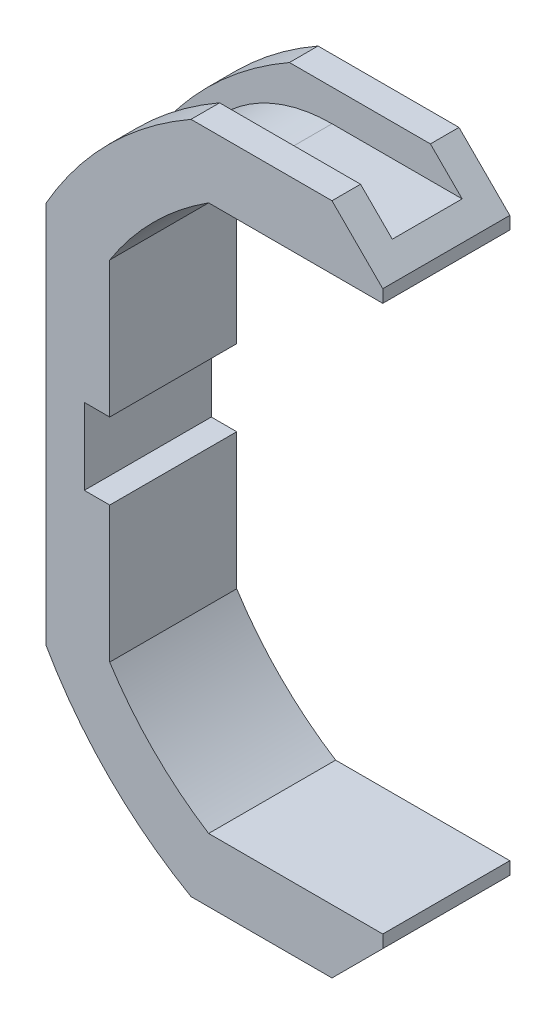
ISO-10303-21;
HEADER;
FILE_DESCRIPTION(('STEP AP214'),'2;1');
FILE_NAME('part.step','',(''),(''),'','','');
FILE_SCHEMA(('AUTOMOTIVE_DESIGN { 1 0 10303 214 1 1 1 1 }'));
ENDSEC;
DATA;
#1=APPLICATION_CONTEXT('core data for automotive mechanical design processes');
#2=APPLICATION_PROTOCOL_DEFINITION('international standard','automotive_design',2000,#1);
#3=PRODUCT_CONTEXT('',#1,'mechanical');
#4=PRODUCT('Part','Part','',(#3));
#5=PRODUCT_RELATED_PRODUCT_CATEGORY('part','',(#4));
#6=PRODUCT_DEFINITION_FORMATION('','',#4);
#7=PRODUCT_DEFINITION_CONTEXT('part definition',#1,'design');
#8=PRODUCT_DEFINITION('design','',#6,#7);
#9=PRODUCT_DEFINITION_SHAPE('','',#8);
#10=(LENGTH_UNIT() NAMED_UNIT(*) SI_UNIT(.MILLI.,.METRE.));
#11=(NAMED_UNIT(*) PLANE_ANGLE_UNIT() SI_UNIT($,.RADIAN.));
#12=(NAMED_UNIT(*) SI_UNIT($,.STERADIAN.) SOLID_ANGLE_UNIT());
#13=UNCERTAINTY_MEASURE_WITH_UNIT(LENGTH_MEASURE(1.E-05),#10,'distance_accuracy_value','');
#14=(GEOMETRIC_REPRESENTATION_CONTEXT(3) GLOBAL_UNCERTAINTY_ASSIGNED_CONTEXT((#13)) GLOBAL_UNIT_ASSIGNED_CONTEXT((#10,
#11,#12)) REPRESENTATION_CONTEXT('',''));
#15=CARTESIAN_POINT('',(0.,0.,0.));
#16=DIRECTION('',(0.,0.,1.));
#17=DIRECTION('',(1.,0.,0.));
#18=AXIS2_PLACEMENT_3D('',#15,#16,#17);
#19=CARTESIAN_POINT('',(-21.5,13.7113092008021,10.));
#20=DIRECTION('',(-1.,0.,0.));
#21=DIRECTION('',(0.,-1.,0.));
#22=AXIS2_PLACEMENT_3D('',#19,#20,#21);
#23=PLANE('',#22);
#24=DIRECTION('',(0.,1.,0.));
#25=VECTOR('',#24,1.);
#26=CARTESIAN_POINT('',(-21.5,13.7113092008021,0.));
#27=LINE('',#26,#25);
#28=CARTESIAN_POINT('',(-21.5,-13.7113092008021,0.));
#29=VERTEX_POINT('',#28);
#30=CARTESIAN_POINT('',(-21.5,-3.,0.));
#31=VERTEX_POINT('',#30);
#32=EDGE_CURVE('E373',#29,#31,#27,.T.);
#33=ORIENTED_EDGE('',*,*,#32,.T.);
#34=DIRECTION('',(0.,0.,1.));
#35=VECTOR('',#34,1.);
#36=CARTESIAN_POINT('',(-21.5,-3.,10.));
#37=LINE('',#36,#35);
#38=CARTESIAN_POINT('',(-21.5,-3.,10.));
#39=VERTEX_POINT('',#38);
#40=EDGE_CURVE('E287',#31,#39,#37,.T.);
#41=ORIENTED_EDGE('',*,*,#40,.T.);
#42=DIRECTION('',(0.,1.,0.));
#43=VECTOR('',#42,1.);
#44=CARTESIAN_POINT('',(-21.5,13.7113092008021,10.));
#45=LINE('',#44,#43);
#46=CARTESIAN_POINT('',(-21.5,-13.7113092008021,10.));
#47=VERTEX_POINT('',#46);
#48=EDGE_CURVE('E345',#47,#39,#45,.T.);
#49=ORIENTED_EDGE('',*,*,#48,.F.);
#50=DIRECTION('',(0.,0.,-1.));
#51=VECTOR('',#50,1.);
#52=CARTESIAN_POINT('',(-21.5,-13.7113092008021,10.));
#53=LINE('',#52,#51);
#54=EDGE_CURVE('E410',#47,#29,#53,.T.);
#55=ORIENTED_EDGE('',*,*,#54,.T.);
#56=EDGE_LOOP('',(#33,#41,#49,#55));
#57=FACE_BOUND('',#56,.T.);
#58=ADVANCED_FACE('F36',(#57),#23,.F.);
#59=CARTESIAN_POINT('',(0.,0.,10.));
#60=DIRECTION('',(0.,0.,-1.));
#61=DIRECTION('',(-1.,0.,0.));
#62=AXIS2_PLACEMENT_3D('',#59,#60,#61);
#63=CYLINDRICAL_SURFACE('',#62,30.5);
#64=CARTESIAN_POINT('',(0.,0.,2.25));
#65=DIRECTION('',(0.,0.,-1.));
#66=DIRECTION('',(0.,1.,0.));
#67=AXIS2_PLACEMENT_3D('',#64,#65,#66);
#68=CIRCLE('',#67,30.5);
#69=CARTESIAN_POINT('',(-15.0996688705415,-26.5,2.25));
#70=VERTEX_POINT('',#69);
#71=CARTESIAN_POINT('',(-26.5,-15.0996688705415,2.25));
#72=VERTEX_POINT('',#71);
#73=EDGE_CURVE('E328',#70,#72,#68,.T.);
#74=ORIENTED_EDGE('',*,*,#73,.T.);
#75=DIRECTION('',(0.,0.,-1.));
#76=VECTOR('',#75,1.);
#77=CARTESIAN_POINT('',(-26.5,-15.0996688705415,10.));
#78=LINE('',#77,#76);
#79=CARTESIAN_POINT('',(-26.5,-15.0996688705415,0.));
#80=VERTEX_POINT('',#79);
#81=EDGE_CURVE('E360',#72,#80,#78,.T.);
#82=ORIENTED_EDGE('',*,*,#81,.T.);
#83=CARTESIAN_POINT('',(0.,0.,0.));
#84=DIRECTION('',(0.,0.,1.));
#85=DIRECTION('',(1.,0.,0.));
#86=AXIS2_PLACEMENT_3D('',#83,#84,#85);
#87=CIRCLE('',#86,30.5);
#88=CARTESIAN_POINT('',(-15.0996688705415,-26.5,0.));
#89=VERTEX_POINT('',#88);
#90=EDGE_CURVE('E330',#80,#89,#87,.T.);
#91=ORIENTED_EDGE('',*,*,#90,.T.);
#92=DIRECTION('',(0.,0.,-1.));
#93=VECTOR('',#92,1.);
#94=CARTESIAN_POINT('',(-15.0996688705415,-26.5,10.));
#95=LINE('',#94,#93);
#96=EDGE_CURVE('E419',#70,#89,#95,.T.);
#97=ORIENTED_EDGE('',*,*,#96,.F.);
#98=EDGE_LOOP('',(#74,#82,#91,#97));
#99=FACE_BOUND('',#98,.T.);
#100=ADVANCED_FACE('F559',(#99),#63,.T.);
#101=CARTESIAN_POINT('',(0.,0.,10.));
#102=DIRECTION('',(0.,0.,-1.));
#103=DIRECTION('',(-1.,0.,0.));
#104=AXIS2_PLACEMENT_3D('',#101,#102,#103);
#105=CYLINDRICAL_SURFACE('',#104,30.5);
#106=DIRECTION('',(0.,0.,-1.));
#107=VECTOR('',#106,1.);
#108=CARTESIAN_POINT('',(-26.5,15.0996688705415,10.));
#109=LINE('',#108,#107);
#110=CARTESIAN_POINT('',(-26.5,15.0996688705415,2.25));
#111=VERTEX_POINT('',#110);
#112=CARTESIAN_POINT('',(-26.5,15.0996688705415,0.));
#113=VERTEX_POINT('',#112);
#114=EDGE_CURVE('E393',#111,#113,#109,.T.);
#115=ORIENTED_EDGE('',*,*,#114,.F.);
#116=CARTESIAN_POINT('',(0.,0.,2.25));
#117=DIRECTION('',(0.,0.,-1.));
#118=DIRECTION('',(-1.,0.,0.));
#119=AXIS2_PLACEMENT_3D('',#116,#117,#118);
#120=CIRCLE('',#119,30.5);
#121=CARTESIAN_POINT('',(-15.0996688705415,26.5,2.25));
#122=VERTEX_POINT('',#121);
#123=EDGE_CURVE('E426',#111,#122,#120,.T.);
#124=ORIENTED_EDGE('',*,*,#123,.T.);
#125=DIRECTION('',(0.,0.,-1.));
#126=VECTOR('',#125,1.);
#127=CARTESIAN_POINT('',(-15.0996688705415,26.5,10.));
#128=LINE('',#127,#126);
#129=CARTESIAN_POINT('',(-15.0996688705415,26.5,0.));
#130=VERTEX_POINT('',#129);
#131=EDGE_CURVE('E397',#122,#130,#128,.T.);
#132=ORIENTED_EDGE('',*,*,#131,.T.);
#133=CARTESIAN_POINT('',(0.,0.,0.));
#134=DIRECTION('',(0.,0.,1.));
#135=DIRECTION('',(1.,0.,0.));
#136=AXIS2_PLACEMENT_3D('',#133,#134,#135);
#137=CIRCLE('',#136,30.5);
#138=EDGE_CURVE('E385',#130,#113,#137,.T.);
#139=ORIENTED_EDGE('',*,*,#138,.T.);
#140=EDGE_LOOP('',(#115,#124,#132,#139));
#141=FACE_BOUND('',#140,.T.);
#142=ADVANCED_FACE('F544',(#141),#105,.T.);
#143=CARTESIAN_POINT('',(-37.5,24.,7.75));
#144=DIRECTION('',(0.,-1.,0.));
#145=DIRECTION('',(0.,0.,-1.));
#146=AXIS2_PLACEMENT_3D('',#143,#144,#145);
#147=PLANE('',#146);
#148=DIRECTION('',(1.,0.,0.));
#149=VECTOR('',#148,1.);
#150=CARTESIAN_POINT('',(-37.5,24.,2.25));
#151=LINE('',#150,#149);
#152=CARTESIAN_POINT('',(-11.7455394214312,24.,2.25));
#153=VERTEX_POINT('',#152);
#154=CARTESIAN_POINT('',(-1.49999999999999,24.,2.25));
#155=VERTEX_POINT('',#154);
#156=EDGE_CURVE('E308',#153,#155,#151,.T.);
#157=ORIENTED_EDGE('',*,*,#156,.F.);
#158=DIRECTION('',(0.,0.,1.));
#159=VECTOR('',#158,1.);
#160=CARTESIAN_POINT('',(-11.7455394214312,24.,7.75));
#161=LINE('',#160,#159);
#162=CARTESIAN_POINT('',(-11.7455394214312,24.,7.75));
#163=VERTEX_POINT('',#162);
#164=EDGE_CURVE('E57',#153,#163,#161,.T.);
#165=ORIENTED_EDGE('',*,*,#164,.T.);
#166=DIRECTION('',(1.,0.,0.));
#167=VECTOR('',#166,1.);
#168=CARTESIAN_POINT('',(-37.5,24.,7.75));
#169=LINE('',#168,#167);
#170=CARTESIAN_POINT('',(-1.49999999999999,24.,7.75));
#171=VERTEX_POINT('',#170);
#172=EDGE_CURVE('E311',#163,#171,#169,.T.);
#173=ORIENTED_EDGE('',*,*,#172,.T.);
#174=DIRECTION('',(0.,0.,1.));
#175=VECTOR('',#174,1.);
#176=CARTESIAN_POINT('',(-1.5,24.,10.));
#177=LINE('',#176,#175);
#178=EDGE_CURVE('E465',#171,#155,#177,.F.);
#179=ORIENTED_EDGE('',*,*,#178,.T.);
#180=EDGE_LOOP('',(#157,#165,#173,#179));
#181=FACE_BOUND('',#180,.T.);
#182=ADVANCED_FACE('F529',(#181),#147,.F.);
#183=CARTESIAN_POINT('',(-37.5,-24.,7.75));
#184=DIRECTION('',(0.,1.,0.));
#185=DIRECTION('',(0.,0.,1.));
#186=AXIS2_PLACEMENT_3D('',#183,#184,#185);
#187=PLANE('',#186);
#188=DIRECTION('',(1.,0.,0.));
#189=VECTOR('',#188,1.);
#190=CARTESIAN_POINT('',(-37.5,-24.,7.75));
#191=LINE('',#190,#189);
#192=CARTESIAN_POINT('',(-11.7455394214312,-24.,7.75));
#193=VERTEX_POINT('',#192);
#194=CARTESIAN_POINT('',(-1.50000000000001,-24.,7.75));
#195=VERTEX_POINT('',#194);
#196=EDGE_CURVE('E313',#193,#195,#191,.T.);
#197=ORIENTED_EDGE('',*,*,#196,.F.);
#198=DIRECTION('',(0.,0.,1.));
#199=VECTOR('',#198,1.);
#200=CARTESIAN_POINT('',(-11.7455394214312,-24.,2.25));
#201=LINE('',#200,#199);
#202=CARTESIAN_POINT('',(-11.7455394214312,-24.,2.25));
#203=VERTEX_POINT('',#202);
#204=EDGE_CURVE('E475',#193,#203,#201,.F.);
#205=ORIENTED_EDGE('',*,*,#204,.T.);
#206=DIRECTION('',(1.,0.,0.));
#207=VECTOR('',#206,1.);
#208=CARTESIAN_POINT('',(-37.5,-24.,2.25));
#209=LINE('',#208,#207);
#210=CARTESIAN_POINT('',(-1.50000000000001,-24.,2.25));
#211=VERTEX_POINT('',#210);
#212=EDGE_CURVE('E305',#203,#211,#209,.T.);
#213=ORIENTED_EDGE('',*,*,#212,.T.);
#214=DIRECTION('',(0.,0.,-1.));
#215=VECTOR('',#214,1.);
#216=CARTESIAN_POINT('',(-1.5,-24.,10.));
#217=LINE('',#216,#215);
#218=EDGE_CURVE('E448',#211,#195,#217,.F.);
#219=ORIENTED_EDGE('',*,*,#218,.T.);
#220=EDGE_LOOP('',(#197,#205,#213,#219));
#221=FACE_BOUND('',#220,.T.);
#222=ADVANCED_FACE('F664',(#221),#187,.F.);
#223=CARTESIAN_POINT('',(-24.5,26.5,2.25));
#224=DIRECTION('',(1.,0.,0.));
#225=DIRECTION('',(0.,0.,-1.));
#226=AXIS2_PLACEMENT_3D('',#223,#224,#225);
#227=PLANE('',#226);
#228=DIRECTION('',(0.,-1.,0.));
#229=VECTOR('',#228,1.);
#230=CARTESIAN_POINT('',(-24.5,26.5,2.25));
#231=LINE('',#230,#229);
#232=CARTESIAN_POINT('',(-24.5,11.1601916434446,2.25));
#233=VERTEX_POINT('',#232);
#234=CARTESIAN_POINT('',(-24.5,-11.1601916434446,2.25));
#235=VERTEX_POINT('',#234);
#236=EDGE_CURVE('E302',#233,#235,#231,.T.);
#237=ORIENTED_EDGE('',*,*,#236,.T.);
#238=DIRECTION('',(0.,0.,1.));
#239=VECTOR('',#238,1.);
#240=CARTESIAN_POINT('',(-24.5,-11.1601916434446,7.75));
#241=LINE('',#240,#239);
#242=CARTESIAN_POINT('',(-24.5,-11.1601916434446,7.75));
#243=VERTEX_POINT('',#242);
#244=EDGE_CURVE('E486',#235,#243,#241,.T.);
#245=ORIENTED_EDGE('',*,*,#244,.T.);
#246=DIRECTION('',(0.,-1.,0.));
#247=VECTOR('',#246,1.);
#248=CARTESIAN_POINT('',(-24.5,26.5,7.75));
#249=LINE('',#248,#247);
#250=CARTESIAN_POINT('',(-24.5,11.1601916434446,7.75));
#251=VERTEX_POINT('',#250);
#252=EDGE_CURVE('E297',#251,#243,#249,.T.);
#253=ORIENTED_EDGE('',*,*,#252,.F.);
#254=DIRECTION('',(0.,0.,1.));
#255=VECTOR('',#254,1.);
#256=CARTESIAN_POINT('',(-24.5,11.1601916434446,2.25));
#257=LINE('',#256,#255);
#258=EDGE_CURVE('E483',#251,#233,#257,.F.);
#259=ORIENTED_EDGE('',*,*,#258,.T.);
#260=EDGE_LOOP('',(#237,#245,#253,#259));
#261=FACE_BOUND('',#260,.T.);
#262=ADVANCED_FACE('F515',(#261),#227,.F.);
#263=CARTESIAN_POINT('',(-26.5,-8.0996688705415,10.));
#264=DIRECTION('',(1.,0.,0.));
#265=DIRECTION('',(0.,0.,-1.));
#266=AXIS2_PLACEMENT_3D('',#263,#264,#265);
#267=PLANE('',#266);
#268=ORIENTED_EDGE('',*,*,#81,.F.);
#269=DIRECTION('',(0.,1.,0.));
#270=VECTOR('',#269,1.);
#271=CARTESIAN_POINT('',(-26.5,-8.0996688705415,2.25));
#272=LINE('',#271,#270);
#273=EDGE_CURVE('E432',#72,#111,#272,.T.);
#274=ORIENTED_EDGE('',*,*,#273,.T.);
#275=ORIENTED_EDGE('',*,*,#114,.T.);
#276=DIRECTION('',(0.,-1.,0.));
#277=VECTOR('',#276,1.);
#278=CARTESIAN_POINT('',(-26.5,-8.0996688705415,0.));
#279=LINE('',#278,#277);
#280=EDGE_CURVE('E335',#113,#80,#279,.T.);
#281=ORIENTED_EDGE('',*,*,#280,.T.);
#282=EDGE_LOOP('',(#268,#274,#275,#281));
#283=FACE_BOUND('',#282,.T.);
#284=ADVANCED_FACE('F552',(#283),#267,.F.);
#285=CARTESIAN_POINT('',(-15.0996688705415,-26.5,10.));
#286=DIRECTION('',(0.,1.,0.));
#287=DIRECTION('',(0.,0.,1.));
#288=AXIS2_PLACEMENT_3D('',#285,#286,#287);
#289=PLANE('',#288);
#290=DIRECTION('',(1.,0.,0.));
#291=VECTOR('',#290,1.);
#292=CARTESIAN_POINT('',(-15.0996688705415,-26.5,0.));
#293=LINE('',#292,#291);
#294=CARTESIAN_POINT('',(-4.00000000000001,-26.5,0.));
#295=VERTEX_POINT('',#294);
#296=EDGE_CURVE('E363',#89,#295,#293,.T.);
#297=ORIENTED_EDGE('',*,*,#296,.T.);
#298=DIRECTION('',(0.,0.,-1.));
#299=VECTOR('',#298,1.);
#300=CARTESIAN_POINT('',(-4.00000000000001,-26.5,10.));
#301=LINE('',#300,#299);
#302=CARTESIAN_POINT('',(-4.00000000000001,-26.5,2.25));
#303=VERTEX_POINT('',#302);
#304=EDGE_CURVE('E441',#295,#303,#301,.F.);
#305=ORIENTED_EDGE('',*,*,#304,.T.);
#306=DIRECTION('',(-1.,0.,0.));
#307=VECTOR('',#306,1.);
#308=CARTESIAN_POINT('',(-15.0996688705415,-26.5,2.25));
#309=LINE('',#308,#307);
#310=EDGE_CURVE('E326',#303,#70,#309,.T.);
#311=ORIENTED_EDGE('',*,*,#310,.T.);
#312=ORIENTED_EDGE('',*,*,#96,.T.);
#313=EDGE_LOOP('',(#297,#305,#311,#312));
#314=FACE_BOUND('',#313,.T.);
#315=ADVANCED_FACE('F561',(#314),#289,.F.);
#316=CARTESIAN_POINT('',(-15.0996688705415,26.5,10.));
#317=DIRECTION('',(0.,-1.,0.));
#318=DIRECTION('',(1.,0.,0.));
#319=AXIS2_PLACEMENT_3D('',#316,#317,#318);
#320=PLANE('',#319);
#321=DIRECTION('',(1.,0.,0.));
#322=VECTOR('',#321,1.);
#323=CARTESIAN_POINT('',(-15.0996688705415,26.5,2.25));
#324=LINE('',#323,#322);
#325=CARTESIAN_POINT('',(-3.99999999999999,26.5,2.25));
#326=VERTEX_POINT('',#325);
#327=EDGE_CURVE('E317',#122,#326,#324,.T.);
#328=ORIENTED_EDGE('',*,*,#327,.T.);
#329=DIRECTION('',(0.,0.,1.));
#330=VECTOR('',#329,1.);
#331=CARTESIAN_POINT('',(-3.99999999999999,26.5,10.));
#332=LINE('',#331,#330);
#333=CARTESIAN_POINT('',(-3.99999999999999,26.5,0.));
#334=VERTEX_POINT('',#333);
#335=EDGE_CURVE('E468',#326,#334,#332,.F.);
#336=ORIENTED_EDGE('',*,*,#335,.T.);
#337=DIRECTION('',(-1.,0.,0.));
#338=VECTOR('',#337,1.);
#339=CARTESIAN_POINT('',(-15.0996688705415,26.5,0.));
#340=LINE('',#339,#338);
#341=EDGE_CURVE('E383',#334,#130,#340,.T.);
#342=ORIENTED_EDGE('',*,*,#341,.T.);
#343=ORIENTED_EDGE('',*,*,#131,.F.);
#344=EDGE_LOOP('',(#328,#336,#342,#343));
#345=FACE_BOUND('',#344,.T.);
#346=ADVANCED_FACE('F538',(#345),#320,.F.);
#347=CARTESIAN_POINT('',(-26.5,-15.0996688705415,10.));
#348=VERTEX_POINT('',#347);
#349=CARTESIAN_POINT('',(-26.5,-15.0996688705415,7.75));
#350=VERTEX_POINT('',#349);
#351=EDGE_CURVE('E390',#348,#350,#78,.T.);
#352=ORIENTED_EDGE('',*,*,#351,.T.);
#353=CARTESIAN_POINT('',(0.,0.,7.75));
#354=DIRECTION('',(0.,0.,1.));
#355=DIRECTION('',(0.,-1.,0.));
#356=AXIS2_PLACEMENT_3D('',#353,#354,#355);
#357=CIRCLE('',#356,30.5);
#358=CARTESIAN_POINT('',(-15.0996688705415,-26.5,7.74999999999999));
#359=VERTEX_POINT('',#358);
#360=EDGE_CURVE('E323',#350,#359,#357,.T.);
#361=ORIENTED_EDGE('',*,*,#360,.T.);
#362=CARTESIAN_POINT('',(-15.0996688705415,-26.5,10.));
#363=VERTEX_POINT('',#362);
#364=EDGE_CURVE('E420',#363,#359,#95,.T.);
#365=ORIENTED_EDGE('',*,*,#364,.F.);
#366=CARTESIAN_POINT('',(0.,0.,10.));
#367=DIRECTION('',(0.,0.,1.));
#368=DIRECTION('',(1.,0.,0.));
#369=AXIS2_PLACEMENT_3D('',#366,#367,#368);
#370=CIRCLE('',#369,30.5);
#371=EDGE_CURVE('E331',#348,#363,#370,.T.);
#372=ORIENTED_EDGE('',*,*,#371,.F.);
#373=EDGE_LOOP('',(#352,#361,#365,#372));
#374=FACE_BOUND('',#373,.T.);
#375=ADVANCED_FACE('F582',(#374),#63,.T.);
#376=DIRECTION('',(1.,0.,0.));
#377=VECTOR('',#376,1.);
#378=CARTESIAN_POINT('',(-15.0996688705415,-26.5,7.74999999999999));
#379=LINE('',#378,#377);
#380=CARTESIAN_POINT('',(-4.00000000000001,-26.5,7.74999999999999));
#381=VERTEX_POINT('',#380);
#382=EDGE_CURVE('E320',#359,#381,#379,.T.);
#383=ORIENTED_EDGE('',*,*,#382,.T.);
#384=DIRECTION('',(0.,0.,1.));
#385=VECTOR('',#384,1.);
#386=CARTESIAN_POINT('',(-4.00000000000001,-26.5,10.));
#387=LINE('',#386,#385);
#388=CARTESIAN_POINT('',(-4.00000000000001,-26.5,10.));
#389=VERTEX_POINT('',#388);
#390=EDGE_CURVE('E456',#381,#389,#387,.T.);
#391=ORIENTED_EDGE('',*,*,#390,.T.);
#392=DIRECTION('',(1.,0.,0.));
#393=VECTOR('',#392,1.);
#394=CARTESIAN_POINT('',(-15.0996688705415,-26.5,10.));
#395=LINE('',#394,#393);
#396=EDGE_CURVE('E334',#363,#389,#395,.T.);
#397=ORIENTED_EDGE('',*,*,#396,.F.);
#398=ORIENTED_EDGE('',*,*,#364,.T.);
#399=EDGE_LOOP('',(#383,#391,#397,#398));
#400=FACE_BOUND('',#399,.T.);
#401=ADVANCED_FACE('F579',(#400),#289,.F.);
#402=CARTESIAN_POINT('',(0.,-21.5,10.));
#403=DIRECTION('',(-1.,0.,0.));
#404=DIRECTION('',(0.,0.,1.));
#405=AXIS2_PLACEMENT_3D('',#402,#403,#404);
#406=PLANE('',#405);
#407=DIRECTION('',(0.,1.,0.));
#408=VECTOR('',#407,1.);
#409=CARTESIAN_POINT('',(0.,-21.5,10.));
#410=LINE('',#409,#408);
#411=CARTESIAN_POINT('',(0.,-22.5,10.));
#412=VERTEX_POINT('',#411);
#413=CARTESIAN_POINT('',(0.,-21.5,10.));
#414=VERTEX_POINT('',#413);
#415=EDGE_CURVE('E338',#412,#414,#410,.T.);
#416=ORIENTED_EDGE('',*,*,#415,.F.);
#417=DIRECTION('',(0.,0.,-1.));
#418=VECTOR('',#417,1.);
#419=CARTESIAN_POINT('',(0.,-22.5,10.));
#420=LINE('',#419,#418);
#421=CARTESIAN_POINT('',(0.,-22.5,0.));
#422=VERTEX_POINT('',#421);
#423=EDGE_CURVE('E434',#412,#422,#420,.T.);
#424=ORIENTED_EDGE('',*,*,#423,.T.);
#425=DIRECTION('',(0.,1.,0.));
#426=VECTOR('',#425,1.);
#427=CARTESIAN_POINT('',(0.,-21.5,0.));
#428=LINE('',#427,#426);
#429=CARTESIAN_POINT('',(0.,-21.5,0.));
#430=VERTEX_POINT('',#429);
#431=EDGE_CURVE('E366',#422,#430,#428,.T.);
#432=ORIENTED_EDGE('',*,*,#431,.T.);
#433=DIRECTION('',(0.,0.,-1.));
#434=VECTOR('',#433,1.);
#435=CARTESIAN_POINT('',(0.,-21.5,10.));
#436=LINE('',#435,#434);
#437=EDGE_CURVE('E416',#414,#430,#436,.T.);
#438=ORIENTED_EDGE('',*,*,#437,.F.);
#439=EDGE_LOOP('',(#416,#424,#432,#438));
#440=FACE_BOUND('',#439,.T.);
#441=ADVANCED_FACE('F571',(#440),#406,.F.);
#442=CARTESIAN_POINT('',(-13.7113092008021,-21.5,10.));
#443=DIRECTION('',(0.,-1.,0.));
#444=DIRECTION('',(0.,0.,-1.));
#445=AXIS2_PLACEMENT_3D('',#442,#443,#444);
#446=PLANE('',#445);
#447=DIRECTION('',(-1.,0.,0.));
#448=VECTOR('',#447,1.);
#449=CARTESIAN_POINT('',(-13.7113092008021,-21.5,0.));
#450=LINE('',#449,#448);
#451=CARTESIAN_POINT('',(-13.7113092008021,-21.5,0.));
#452=VERTEX_POINT('',#451);
#453=EDGE_CURVE('E368',#430,#452,#450,.T.);
#454=ORIENTED_EDGE('',*,*,#453,.T.);
#455=DIRECTION('',(0.,0.,-1.));
#456=VECTOR('',#455,1.);
#457=CARTESIAN_POINT('',(-13.7113092008021,-21.5,10.));
#458=LINE('',#457,#456);
#459=CARTESIAN_POINT('',(-13.7113092008021,-21.5,10.));
#460=VERTEX_POINT('',#459);
#461=EDGE_CURVE('E413',#460,#452,#458,.T.);
#462=ORIENTED_EDGE('',*,*,#461,.F.);
#463=DIRECTION('',(-1.,0.,0.));
#464=VECTOR('',#463,1.);
#465=CARTESIAN_POINT('',(-13.7113092008021,-21.5,10.));
#466=LINE('',#465,#464);
#467=EDGE_CURVE('E340',#414,#460,#466,.T.);
#468=ORIENTED_EDGE('',*,*,#467,.F.);
#469=ORIENTED_EDGE('',*,*,#437,.T.);
#470=EDGE_LOOP('',(#454,#462,#468,#469));
#471=FACE_BOUND('',#470,.T.);
#472=ADVANCED_FACE('F627',(#471),#446,.F.);
#473=CARTESIAN_POINT('',(0.,0.,10.));
#474=DIRECTION('',(0.,0.,-1.));
#475=DIRECTION('',(-1.,0.,0.));
#476=AXIS2_PLACEMENT_3D('',#473,#474,#475);
#477=CYLINDRICAL_SURFACE('',#476,25.5);
#478=CARTESIAN_POINT('',(0.,0.,0.));
#479=DIRECTION('',(0.,0.,-1.));
#480=DIRECTION('',(1.,0.,0.));
#481=AXIS2_PLACEMENT_3D('',#478,#479,#480);
#482=CIRCLE('',#481,25.5);
#483=EDGE_CURVE('E370',#452,#29,#482,.T.);
#484=ORIENTED_EDGE('',*,*,#483,.T.);
#485=ORIENTED_EDGE('',*,*,#54,.F.);
#486=CARTESIAN_POINT('',(0.,0.,10.));
#487=DIRECTION('',(0.,0.,-1.));
#488=DIRECTION('',(1.,0.,0.));
#489=AXIS2_PLACEMENT_3D('',#486,#487,#488);
#490=CIRCLE('',#489,25.5);
#491=EDGE_CURVE('E342',#460,#47,#490,.T.);
#492=ORIENTED_EDGE('',*,*,#491,.F.);
#493=ORIENTED_EDGE('',*,*,#461,.T.);
#494=EDGE_LOOP('',(#484,#485,#492,#493));
#495=FACE_BOUND('',#494,.T.);
#496=ADVANCED_FACE('F625',(#495),#477,.F.);
#497=CARTESIAN_POINT('',(-21.5,3.,10.));
#498=VERTEX_POINT('',#497);
#499=CARTESIAN_POINT('',(-21.5,13.7113092008021,10.));
#500=VERTEX_POINT('',#499);
#501=EDGE_CURVE('E344',#498,#500,#45,.T.);
#502=ORIENTED_EDGE('',*,*,#501,.F.);
#503=DIRECTION('',(0.,0.,-1.));
#504=VECTOR('',#503,1.);
#505=CARTESIAN_POINT('',(-21.5,3.,10.));
#506=LINE('',#505,#504);
#507=CARTESIAN_POINT('',(-21.5,3.,0.));
#508=VERTEX_POINT('',#507);
#509=EDGE_CURVE('E273',#498,#508,#506,.T.);
#510=ORIENTED_EDGE('',*,*,#509,.T.);
#511=CARTESIAN_POINT('',(-21.5,13.7113092008021,0.));
#512=VERTEX_POINT('',#511);
#513=EDGE_CURVE('E372',#508,#512,#27,.T.);
#514=ORIENTED_EDGE('',*,*,#513,.T.);
#515=DIRECTION('',(0.,0.,-1.));
#516=VECTOR('',#515,1.);
#517=CARTESIAN_POINT('',(-21.5,13.7113092008021,10.));
#518=LINE('',#517,#516);
#519=EDGE_CURVE('E407',#500,#512,#518,.T.);
#520=ORIENTED_EDGE('',*,*,#519,.F.);
#521=EDGE_LOOP('',(#502,#510,#514,#520));
#522=FACE_BOUND('',#521,.T.);
#523=ADVANCED_FACE('F616',(#522),#23,.F.);
#524=CARTESIAN_POINT('',(0.,0.,10.));
#525=DIRECTION('',(0.,0.,-1.));
#526=DIRECTION('',(-1.,0.,0.));
#527=AXIS2_PLACEMENT_3D('',#524,#525,#526);
#528=CYLINDRICAL_SURFACE('',#527,25.5);
#529=CARTESIAN_POINT('',(0.,0.,0.));
#530=DIRECTION('',(0.,0.,-1.));
#531=DIRECTION('',(1.,0.,0.));
#532=AXIS2_PLACEMENT_3D('',#529,#530,#531);
#533=CIRCLE('',#532,25.5);
#534=CARTESIAN_POINT('',(-13.7113092008021,21.5,0.));
#535=VERTEX_POINT('',#534);
#536=EDGE_CURVE('E376',#512,#535,#533,.T.);
#537=ORIENTED_EDGE('',*,*,#536,.T.);
#538=DIRECTION('',(0.,0.,-1.));
#539=VECTOR('',#538,1.);
#540=CARTESIAN_POINT('',(-13.7113092008021,21.5,10.));
#541=LINE('',#540,#539);
#542=CARTESIAN_POINT('',(-13.7113092008021,21.5,10.));
#543=VERTEX_POINT('',#542);
#544=EDGE_CURVE('E404',#543,#535,#541,.T.);
#545=ORIENTED_EDGE('',*,*,#544,.F.);
#546=CARTESIAN_POINT('',(0.,0.,10.));
#547=DIRECTION('',(0.,0.,-1.));
#548=DIRECTION('',(1.,0.,0.));
#549=AXIS2_PLACEMENT_3D('',#546,#547,#548);
#550=CIRCLE('',#549,25.5);
#551=EDGE_CURVE('E347',#500,#543,#550,.T.);
#552=ORIENTED_EDGE('',*,*,#551,.F.);
#553=ORIENTED_EDGE('',*,*,#519,.T.);
#554=EDGE_LOOP('',(#537,#545,#552,#553));
#555=FACE_BOUND('',#554,.T.);
#556=ADVANCED_FACE('F613',(#555),#528,.F.);
#557=CARTESIAN_POINT('',(-13.7113092008021,21.5,10.));
#558=DIRECTION('',(0.,1.,0.));
#559=DIRECTION('',(0.,0.,1.));
#560=AXIS2_PLACEMENT_3D('',#557,#558,#559);
#561=PLANE('',#560);
#562=DIRECTION('',(1.,0.,0.));
#563=VECTOR('',#562,1.);
#564=CARTESIAN_POINT('',(-13.7113092008021,21.5,0.));
#565=LINE('',#564,#563);
#566=CARTESIAN_POINT('',(0.,21.5,0.));
#567=VERTEX_POINT('',#566);
#568=EDGE_CURVE('E378',#535,#567,#565,.T.);
#569=ORIENTED_EDGE('',*,*,#568,.T.);
#570=DIRECTION('',(0.,0.,-1.));
#571=VECTOR('',#570,1.);
#572=CARTESIAN_POINT('',(0.,21.5,10.));
#573=LINE('',#572,#571);
#574=CARTESIAN_POINT('',(0.,21.5,10.));
#575=VERTEX_POINT('',#574);
#576=EDGE_CURVE('E401',#575,#567,#573,.T.);
#577=ORIENTED_EDGE('',*,*,#576,.F.);
#578=DIRECTION('',(1.,0.,0.));
#579=VECTOR('',#578,1.);
#580=CARTESIAN_POINT('',(-13.7113092008021,21.5,10.));
#581=LINE('',#580,#579);
#582=EDGE_CURVE('E349',#543,#575,#581,.T.);
#583=ORIENTED_EDGE('',*,*,#582,.F.);
#584=ORIENTED_EDGE('',*,*,#544,.T.);
#585=EDGE_LOOP('',(#569,#577,#583,#584));
#586=FACE_BOUND('',#585,.T.);
#587=ADVANCED_FACE('F609',(#586),#561,.F.);
#588=CARTESIAN_POINT('',(0.,21.5,10.));
#589=DIRECTION('',(-1.,0.,0.));
#590=DIRECTION('',(0.,0.,1.));
#591=AXIS2_PLACEMENT_3D('',#588,#589,#590);
#592=PLANE('',#591);
#593=DIRECTION('',(0.,1.,0.));
#594=VECTOR('',#593,1.);
#595=CARTESIAN_POINT('',(0.,21.5,0.));
#596=LINE('',#595,#594);
#597=CARTESIAN_POINT('',(0.,22.5,0.));
#598=VERTEX_POINT('',#597);
#599=EDGE_CURVE('E380',#567,#598,#596,.T.);
#600=ORIENTED_EDGE('',*,*,#599,.T.);
#601=DIRECTION('',(0.,0.,1.));
#602=VECTOR('',#601,1.);
#603=CARTESIAN_POINT('',(0.,22.5,10.));
#604=LINE('',#603,#602);
#605=CARTESIAN_POINT('',(0.,22.5,10.));
#606=VERTEX_POINT('',#605);
#607=EDGE_CURVE('E470',#598,#606,#604,.T.);
#608=ORIENTED_EDGE('',*,*,#607,.T.);
#609=DIRECTION('',(0.,1.,0.));
#610=VECTOR('',#609,1.);
#611=CARTESIAN_POINT('',(0.,21.5,10.));
#612=LINE('',#611,#610);
#613=EDGE_CURVE('E351',#575,#606,#612,.T.);
#614=ORIENTED_EDGE('',*,*,#613,.F.);
#615=ORIENTED_EDGE('',*,*,#576,.T.);
#616=EDGE_LOOP('',(#600,#608,#614,#615));
#617=FACE_BOUND('',#616,.T.);
#618=ADVANCED_FACE('F603',(#617),#592,.F.);
#619=DIRECTION('',(-1.,0.,0.));
#620=VECTOR('',#619,1.);
#621=CARTESIAN_POINT('',(-15.0996688705415,26.5,10.));
#622=LINE('',#621,#620);
#623=CARTESIAN_POINT('',(-3.99999999999999,26.5,10.));
#624=VERTEX_POINT('',#623);
#625=CARTESIAN_POINT('',(-15.0996688705415,26.5,10.));
#626=VERTEX_POINT('',#625);
#627=EDGE_CURVE('E354',#624,#626,#622,.T.);
#628=ORIENTED_EDGE('',*,*,#627,.F.);
#629=DIRECTION('',(0.,0.,-1.));
#630=VECTOR('',#629,1.);
#631=CARTESIAN_POINT('',(-3.99999999999999,26.5,10.));
#632=LINE('',#631,#630);
#633=CARTESIAN_POINT('',(-3.99999999999999,26.5,7.75));
#634=VERTEX_POINT('',#633);
#635=EDGE_CURVE('E462',#624,#634,#632,.T.);
#636=ORIENTED_EDGE('',*,*,#635,.T.);
#637=DIRECTION('',(-1.,0.,0.));
#638=VECTOR('',#637,1.);
#639=CARTESIAN_POINT('',(-15.0996688705415,26.5,7.75));
#640=LINE('',#639,#638);
#641=CARTESIAN_POINT('',(-15.0996688705415,26.5,7.75));
#642=VERTEX_POINT('',#641);
#643=EDGE_CURVE('E310',#634,#642,#640,.T.);
#644=ORIENTED_EDGE('',*,*,#643,.T.);
#645=EDGE_CURVE('E398',#626,#642,#128,.T.);
#646=ORIENTED_EDGE('',*,*,#645,.F.);
#647=EDGE_LOOP('',(#628,#636,#644,#646));
#648=FACE_BOUND('',#647,.T.);
#649=ADVANCED_FACE('F596',(#648),#320,.F.);
#650=CARTESIAN_POINT('',(0.,0.,7.75));
#651=DIRECTION('',(0.,0.,1.));
#652=DIRECTION('',(1.,0.,0.));
#653=AXIS2_PLACEMENT_3D('',#650,#651,#652);
#654=CIRCLE('',#653,30.5);
#655=CARTESIAN_POINT('',(-26.5,15.0996688705415,7.75));
#656=VERTEX_POINT('',#655);
#657=EDGE_CURVE('E423',#642,#656,#654,.T.);
#658=ORIENTED_EDGE('',*,*,#657,.T.);
#659=CARTESIAN_POINT('',(-26.5,15.0996688705415,10.));
#660=VERTEX_POINT('',#659);
#661=EDGE_CURVE('E394',#660,#656,#109,.T.);
#662=ORIENTED_EDGE('',*,*,#661,.F.);
#663=CARTESIAN_POINT('',(0.,0.,10.));
#664=DIRECTION('',(0.,0.,1.));
#665=DIRECTION('',(1.,0.,0.));
#666=AXIS2_PLACEMENT_3D('',#663,#664,#665);
#667=CIRCLE('',#666,30.5);
#668=EDGE_CURVE('E356',#626,#660,#667,.T.);
#669=ORIENTED_EDGE('',*,*,#668,.F.);
#670=ORIENTED_EDGE('',*,*,#645,.T.);
#671=EDGE_LOOP('',(#658,#662,#669,#670));
#672=FACE_BOUND('',#671,.T.);
#673=ADVANCED_FACE('F591',(#672),#105,.T.);
#674=ORIENTED_EDGE('',*,*,#351,.F.);
#675=DIRECTION('',(0.,-1.,0.));
#676=VECTOR('',#675,1.);
#677=CARTESIAN_POINT('',(-26.5,15.0996688705415,10.));
#678=LINE('',#677,#676);
#679=EDGE_CURVE('E358',#660,#348,#678,.T.);
#680=ORIENTED_EDGE('',*,*,#679,.F.);
#681=ORIENTED_EDGE('',*,*,#661,.T.);
#682=DIRECTION('',(0.,-1.,0.));
#683=VECTOR('',#682,1.);
#684=CARTESIAN_POINT('',(-26.5,-8.0996688705415,7.75));
#685=LINE('',#684,#683);
#686=EDGE_CURVE('E429',#656,#350,#685,.T.);
#687=ORIENTED_EDGE('',*,*,#686,.T.);
#688=EDGE_LOOP('',(#674,#680,#681,#687));
#689=FACE_BOUND('',#688,.T.);
#690=ADVANCED_FACE('F587',(#689),#267,.F.);
#691=CARTESIAN_POINT('',(0.,0.,10.));
#692=DIRECTION('',(0.,0.,1.));
#693=DIRECTION('',(1.,0.,0.));
#694=AXIS2_PLACEMENT_3D('',#691,#692,#693);
#695=PLANE('',#694);
#696=ORIENTED_EDGE('',*,*,#679,.T.);
#697=ORIENTED_EDGE('',*,*,#371,.T.);
#698=ORIENTED_EDGE('',*,*,#396,.T.);
#699=DIRECTION('',(-0.707106781186548,-0.707106781186547,0.));
#700=VECTOR('',#699,1.);
#701=CARTESIAN_POINT('',(11.25,-11.25,10.));
#702=LINE('',#701,#700);
#703=EDGE_CURVE('E460',#389,#412,#702,.F.);
#704=ORIENTED_EDGE('',*,*,#703,.T.);
#705=ORIENTED_EDGE('',*,*,#415,.T.);
#706=ORIENTED_EDGE('',*,*,#467,.T.);
#707=ORIENTED_EDGE('',*,*,#491,.T.);
#708=ORIENTED_EDGE('',*,*,#48,.T.);
#709=DIRECTION('',(-1.,0.,0.));
#710=VECTOR('',#709,1.);
#711=CARTESIAN_POINT('',(-19.5,-3.,10.));
#712=LINE('',#711,#710);
#713=CARTESIAN_POINT('',(-23.5,-3.,10.));
#714=VERTEX_POINT('',#713);
#715=EDGE_CURVE('E267',#39,#714,#712,.T.);
#716=ORIENTED_EDGE('',*,*,#715,.T.);
#717=DIRECTION('',(0.,1.,0.));
#718=VECTOR('',#717,1.);
#719=CARTESIAN_POINT('',(-23.5,3.,10.));
#720=LINE('',#719,#718);
#721=CARTESIAN_POINT('',(-23.5,3.,10.));
#722=VERTEX_POINT('',#721);
#723=EDGE_CURVE('E260',#714,#722,#720,.T.);
#724=ORIENTED_EDGE('',*,*,#723,.T.);
#725=DIRECTION('',(1.,0.,0.));
#726=VECTOR('',#725,1.);
#727=CARTESIAN_POINT('',(-19.5,3.,10.));
#728=LINE('',#727,#726);
#729=EDGE_CURVE('E270',#722,#498,#728,.T.);
#730=ORIENTED_EDGE('',*,*,#729,.T.);
#731=ORIENTED_EDGE('',*,*,#501,.T.);
#732=ORIENTED_EDGE('',*,*,#551,.T.);
#733=ORIENTED_EDGE('',*,*,#582,.T.);
#734=ORIENTED_EDGE('',*,*,#613,.T.);
#735=DIRECTION('',(0.707106781186546,-0.707106781186549,0.));
#736=VECTOR('',#735,1.);
#737=CARTESIAN_POINT('',(11.25,11.2499999999999,10.));
#738=LINE('',#737,#736);
#739=EDGE_CURVE('E458',#606,#624,#738,.F.);
#740=ORIENTED_EDGE('',*,*,#739,.T.);
#741=ORIENTED_EDGE('',*,*,#627,.T.);
#742=ORIENTED_EDGE('',*,*,#668,.T.);
#743=EDGE_LOOP('',(#696,#697,#698,#704,#705,#706,#707,#708,#716,#724,#730,#731,#732,#733,#734,
#740,#741,#742));
#744=FACE_BOUND('',#743,.T.);
#745=ADVANCED_FACE('F277',(#744),#695,.T.);
#746=CARTESIAN_POINT('',(0.,0.,0.));
#747=DIRECTION('',(0.,0.,1.));
#748=DIRECTION('',(1.,0.,0.));
#749=AXIS2_PLACEMENT_3D('',#746,#747,#748);
#750=PLANE('',#749);
#751=ORIENTED_EDGE('',*,*,#280,.F.);
#752=ORIENTED_EDGE('',*,*,#138,.F.);
#753=ORIENTED_EDGE('',*,*,#341,.F.);
#754=DIRECTION('',(-0.707106781186546,0.707106781186549,0.));
#755=VECTOR('',#754,1.);
#756=CARTESIAN_POINT('',(-3.99999999999999,26.5,0.));
#757=LINE('',#756,#755);
#758=EDGE_CURVE('E437',#334,#598,#757,.F.);
#759=ORIENTED_EDGE('',*,*,#758,.T.);
#760=ORIENTED_EDGE('',*,*,#599,.F.);
#761=ORIENTED_EDGE('',*,*,#568,.F.);
#762=ORIENTED_EDGE('',*,*,#536,.F.);
#763=ORIENTED_EDGE('',*,*,#513,.F.);
#764=DIRECTION('',(1.,0.,0.));
#765=VECTOR('',#764,1.);
#766=CARTESIAN_POINT('',(-19.5,3.,0.));
#767=LINE('',#766,#765);
#768=CARTESIAN_POINT('',(-23.5,3.,0.));
#769=VERTEX_POINT('',#768);
#770=EDGE_CURVE('E279',#769,#508,#767,.T.);
#771=ORIENTED_EDGE('',*,*,#770,.F.);
#772=DIRECTION('',(0.,1.,0.));
#773=VECTOR('',#772,1.);
#774=CARTESIAN_POINT('',(-23.5,3.,0.));
#775=LINE('',#774,#773);
#776=CARTESIAN_POINT('',(-23.5,-3.,0.));
#777=VERTEX_POINT('',#776);
#778=EDGE_CURVE('E263',#777,#769,#775,.T.);
#779=ORIENTED_EDGE('',*,*,#778,.F.);
#780=DIRECTION('',(1.,0.,0.));
#781=VECTOR('',#780,1.);
#782=CARTESIAN_POINT('',(0.,-3.,0.));
#783=LINE('',#782,#781);
#784=EDGE_CURVE('E472',#777,#31,#783,.T.);
#785=ORIENTED_EDGE('',*,*,#784,.T.);
#786=ORIENTED_EDGE('',*,*,#32,.F.);
#787=ORIENTED_EDGE('',*,*,#483,.F.);
#788=ORIENTED_EDGE('',*,*,#453,.F.);
#789=ORIENTED_EDGE('',*,*,#431,.F.);
#790=DIRECTION('',(0.707106781186548,0.707106781186547,0.));
#791=VECTOR('',#790,1.);
#792=CARTESIAN_POINT('',(0.,-22.5,0.));
#793=LINE('',#792,#791);
#794=EDGE_CURVE('E439',#422,#295,#793,.F.);
#795=ORIENTED_EDGE('',*,*,#794,.T.);
#796=ORIENTED_EDGE('',*,*,#296,.F.);
#797=ORIENTED_EDGE('',*,*,#90,.F.);
#798=EDGE_LOOP('',(#751,#752,#753,#759,#760,#761,#762,#763,#771,#779,#785,#786,#787,#788,#789,
#795,#796,#797));
#799=FACE_BOUND('',#798,.T.);
#800=ADVANCED_FACE('F546',(#799),#750,.F.);
#801=CARTESIAN_POINT('',(-37.5,24.,2.25));
#802=DIRECTION('',(0.,0.,-1.));
#803=DIRECTION('',(-1.,0.,0.));
#804=AXIS2_PLACEMENT_3D('',#801,#802,#803);
#805=PLANE('',#804);
#806=ORIENTED_EDGE('',*,*,#123,.F.);
#807=ORIENTED_EDGE('',*,*,#273,.F.);
#808=ORIENTED_EDGE('',*,*,#73,.F.);
#809=ORIENTED_EDGE('',*,*,#310,.F.);
#810=DIRECTION('',(-0.707106781186548,-0.707106781186547,0.));
#811=VECTOR('',#810,1.);
#812=CARTESIAN_POINT('',(0.,-22.5,2.25));
#813=LINE('',#812,#811);
#814=EDGE_CURVE('E445',#303,#211,#813,.F.);
#815=ORIENTED_EDGE('',*,*,#814,.T.);
#816=ORIENTED_EDGE('',*,*,#212,.F.);
#817=CARTESIAN_POINT('',(-11.7455394214312,-12.,2.25));
#818=DIRECTION('',(0.,0.,-1.));
#819=DIRECTION('',(-1.,0.,0.));
#820=AXIS2_PLACEMENT_3D('',#817,#818,#819);
#821=CIRCLE('',#820,12.);
#822=CARTESIAN_POINT('',(-20.477300901689,-20.2314240233319,2.25));
#823=VERTEX_POINT('',#822);
#824=EDGE_CURVE('E494',#203,#823,#821,.T.);
#825=ORIENTED_EDGE('',*,*,#824,.T.);
#826=CARTESIAN_POINT('',(5.37270622710614,4.1373554221853,2.25));
#827=DIRECTION('',(0.,0.,-1.));
#828=DIRECTION('',(-1.,0.,0.));
#829=AXIS2_PLACEMENT_3D('',#826,#827,#828);
#830=CIRCLE('',#829,35.5254877548926);
#831=CARTESIAN_POINT('',(-21.6166005551009,-18.9632419648723,2.25));
#832=VERTEX_POINT('',#831);
#833=EDGE_CURVE('E290',#823,#832,#830,.T.);
#834=ORIENTED_EDGE('',*,*,#833,.T.);
#835=CARTESIAN_POINT('',(-12.5,-11.1601916434446,2.25));
#836=DIRECTION('',(0.,0.,-1.));
#837=DIRECTION('',(-1.,0.,0.));
#838=AXIS2_PLACEMENT_3D('',#835,#836,#837);
#839=CIRCLE('',#838,12.);
#840=EDGE_CURVE('E498',#832,#235,#839,.T.);
#841=ORIENTED_EDGE('',*,*,#840,.T.);
#842=ORIENTED_EDGE('',*,*,#236,.F.);
#843=CARTESIAN_POINT('',(-12.5,11.1601916434446,2.25));
#844=DIRECTION('',(0.,0.,-1.));
#845=DIRECTION('',(-1.,0.,0.));
#846=AXIS2_PLACEMENT_3D('',#843,#844,#845);
#847=CIRCLE('',#846,12.);
#848=CARTESIAN_POINT('',(-21.6166005551009,18.9632419648723,2.25));
#849=VERTEX_POINT('',#848);
#850=EDGE_CURVE('E502',#233,#849,#847,.T.);
#851=ORIENTED_EDGE('',*,*,#850,.T.);
#852=CARTESIAN_POINT('',(5.37270622710614,-4.1373554221853,2.25));
#853=DIRECTION('',(0.,0.,-1.));
#854=DIRECTION('',(1.,0.,0.));
#855=AXIS2_PLACEMENT_3D('',#852,#853,#854);
#856=CIRCLE('',#855,35.5254877548926);
#857=CARTESIAN_POINT('',(-20.477300901689,20.2314240233319,2.25));
#858=VERTEX_POINT('',#857);
#859=EDGE_CURVE('E291',#849,#858,#856,.T.);
#860=ORIENTED_EDGE('',*,*,#859,.T.);
#861=CARTESIAN_POINT('',(-11.7455394214312,12.,2.25));
#862=DIRECTION('',(0.,0.,-1.));
#863=DIRECTION('',(-1.,0.,0.));
#864=AXIS2_PLACEMENT_3D('',#861,#862,#863);
#865=CIRCLE('',#864,12.);
#866=EDGE_CURVE('E44',#858,#153,#865,.T.);
#867=ORIENTED_EDGE('',*,*,#866,.T.);
#868=ORIENTED_EDGE('',*,*,#156,.T.);
#869=DIRECTION('',(0.707106781186546,-0.707106781186549,0.));
#870=VECTOR('',#869,1.);
#871=CARTESIAN_POINT('',(-3.99999999999999,26.5,2.25));
#872=LINE('',#871,#870);
#873=EDGE_CURVE('E443',#155,#326,#872,.F.);
#874=ORIENTED_EDGE('',*,*,#873,.T.);
#875=ORIENTED_EDGE('',*,*,#327,.F.);
#876=EDGE_LOOP('',(#806,#807,#808,#809,#815,#816,#825,#834,#841,#842,#851,#860,#867,#868,#874,#875));
#877=FACE_BOUND('',#876,.T.);
#878=ADVANCED_FACE('F521',(#877),#805,.F.);
#879=CARTESIAN_POINT('',(-37.5,24.,7.75));
#880=DIRECTION('',(0.,0.,1.));
#881=DIRECTION('',(1.,0.,0.));
#882=AXIS2_PLACEMENT_3D('',#879,#880,#881);
#883=PLANE('',#882);
#884=ORIENTED_EDGE('',*,*,#686,.F.);
#885=ORIENTED_EDGE('',*,*,#657,.F.);
#886=ORIENTED_EDGE('',*,*,#643,.F.);
#887=DIRECTION('',(-0.707106781186546,0.707106781186549,0.));
#888=VECTOR('',#887,1.);
#889=CARTESIAN_POINT('',(-3.99999999999999,26.5,7.75));
#890=LINE('',#889,#888);
#891=EDGE_CURVE('E451',#634,#171,#890,.F.);
#892=ORIENTED_EDGE('',*,*,#891,.T.);
#893=ORIENTED_EDGE('',*,*,#172,.F.);
#894=CARTESIAN_POINT('',(-11.7455394214312,12.,7.75));
#895=DIRECTION('',(0.,0.,1.));
#896=DIRECTION('',(1.,0.,0.));
#897=AXIS2_PLACEMENT_3D('',#894,#895,#896);
#898=CIRCLE('',#897,12.);
#899=CARTESIAN_POINT('',(-20.477300901689,20.2314240233319,7.75));
#900=VERTEX_POINT('',#899);
#901=EDGE_CURVE('E11',#163,#900,#898,.T.);
#902=ORIENTED_EDGE('',*,*,#901,.T.);
#903=CARTESIAN_POINT('',(5.37270622710614,-4.1373554221853,7.75));
#904=DIRECTION('',(0.,0.,1.));
#905=DIRECTION('',(1.,0.,0.));
#906=AXIS2_PLACEMENT_3D('',#903,#904,#905);
#907=CIRCLE('',#906,35.5254877548926);
#908=CARTESIAN_POINT('',(-21.6166005551009,18.9632419648723,7.75));
#909=VERTEX_POINT('',#908);
#910=EDGE_CURVE('E293',#909,#900,#907,.F.);
#911=ORIENTED_EDGE('',*,*,#910,.F.);
#912=CARTESIAN_POINT('',(-12.5,11.1601916434446,7.75));
#913=DIRECTION('',(0.,0.,1.));
#914=DIRECTION('',(1.,0.,0.));
#915=AXIS2_PLACEMENT_3D('',#912,#913,#914);
#916=CIRCLE('',#915,12.);
#917=EDGE_CURVE('E504',#909,#251,#916,.T.);
#918=ORIENTED_EDGE('',*,*,#917,.T.);
#919=ORIENTED_EDGE('',*,*,#252,.T.);
#920=CARTESIAN_POINT('',(-12.5,-11.1601916434446,7.75));
#921=DIRECTION('',(0.,0.,1.));
#922=DIRECTION('',(1.,0.,0.));
#923=AXIS2_PLACEMENT_3D('',#920,#921,#922);
#924=CIRCLE('',#923,12.);
#925=CARTESIAN_POINT('',(-21.6166005551009,-18.9632419648723,7.75));
#926=VERTEX_POINT('',#925);
#927=EDGE_CURVE('E500',#243,#926,#924,.T.);
#928=ORIENTED_EDGE('',*,*,#927,.T.);
#929=CARTESIAN_POINT('',(5.37270622710614,4.1373554221853,7.75));
#930=DIRECTION('',(0.,0.,1.));
#931=DIRECTION('',(1.,0.,0.));
#932=AXIS2_PLACEMENT_3D('',#929,#930,#931);
#933=CIRCLE('',#932,35.5254877548926);
#934=CARTESIAN_POINT('',(-20.477300901689,-20.2314240233319,7.75));
#935=VERTEX_POINT('',#934);
#936=EDGE_CURVE('E294',#935,#926,#933,.F.);
#937=ORIENTED_EDGE('',*,*,#936,.F.);
#938=CARTESIAN_POINT('',(-11.7455394214312,-12.,7.75));
#939=DIRECTION('',(0.,0.,1.));
#940=DIRECTION('',(1.,0.,0.));
#941=AXIS2_PLACEMENT_3D('',#938,#939,#940);
#942=CIRCLE('',#941,12.);
#943=EDGE_CURVE('E496',#935,#193,#942,.T.);
#944=ORIENTED_EDGE('',*,*,#943,.T.);
#945=ORIENTED_EDGE('',*,*,#196,.T.);
#946=DIRECTION('',(0.707106781186548,0.707106781186547,0.));
#947=VECTOR('',#946,1.);
#948=CARTESIAN_POINT('',(0.,-22.5,7.75));
#949=LINE('',#948,#947);
#950=EDGE_CURVE('E454',#195,#381,#949,.F.);
#951=ORIENTED_EDGE('',*,*,#950,.T.);
#952=ORIENTED_EDGE('',*,*,#382,.F.);
#953=ORIENTED_EDGE('',*,*,#360,.F.);
#954=EDGE_LOOP('',(#884,#885,#886,#892,#893,#902,#911,#918,#919,#928,#937,#944,#945,#951,#952,#953));
#955=FACE_BOUND('',#954,.T.);
#956=ADVANCED_FACE('F509',(#955),#883,.F.);
#957=CARTESIAN_POINT('',(5.37270622710614,4.1373554221853,19.8491487628354));
#958=DIRECTION('',(0.,0.,-1.));
#959=DIRECTION('',(-1.,0.,0.));
#960=AXIS2_PLACEMENT_3D('',#957,#958,#959);
#961=CYLINDRICAL_SURFACE('',#960,35.5254877548926);
#962=ORIENTED_EDGE('',*,*,#833,.F.);
#963=DIRECTION('',(0.,0.,-1.));
#964=VECTOR('',#963,1.);
#965=CARTESIAN_POINT('',(-20.477300901689,-20.2314240233319,19.8491487628354));
#966=LINE('',#965,#964);
#967=EDGE_CURVE('E481',#823,#935,#966,.F.);
#968=ORIENTED_EDGE('',*,*,#967,.T.);
#969=ORIENTED_EDGE('',*,*,#936,.T.);
#970=DIRECTION('',(0.,0.,-1.));
#971=VECTOR('',#970,1.);
#972=CARTESIAN_POINT('',(-21.6166005551009,-18.9632419648723,19.8491487628354));
#973=LINE('',#972,#971);
#974=EDGE_CURVE('E478',#926,#832,#973,.T.);
#975=ORIENTED_EDGE('',*,*,#974,.T.);
#976=EDGE_LOOP('',(#962,#968,#969,#975));
#977=FACE_BOUND('',#976,.T.);
#978=ADVANCED_FACE('F672',(#977),#961,.T.);
#979=CARTESIAN_POINT('',(5.37270622710614,-4.1373554221853,19.8491487628354));
#980=DIRECTION('',(0.,0.,-1.));
#981=DIRECTION('',(-1.,0.,0.));
#982=AXIS2_PLACEMENT_3D('',#979,#980,#981);
#983=CYLINDRICAL_SURFACE('',#982,35.5254877548926);
#984=ORIENTED_EDGE('',*,*,#859,.F.);
#985=DIRECTION('',(0.,0.,-1.));
#986=VECTOR('',#985,1.);
#987=CARTESIAN_POINT('',(-21.6166005551009,18.9632419648723,19.8491487628354));
#988=LINE('',#987,#986);
#989=EDGE_CURVE('E491',#849,#909,#988,.F.);
#990=ORIENTED_EDGE('',*,*,#989,.T.);
#991=ORIENTED_EDGE('',*,*,#910,.T.);
#992=DIRECTION('',(0.,0.,-1.));
#993=VECTOR('',#992,1.);
#994=CARTESIAN_POINT('',(-20.477300901689,20.2314240233319,19.8491487628354));
#995=LINE('',#994,#993);
#996=EDGE_CURVE('E488',#900,#858,#995,.T.);
#997=ORIENTED_EDGE('',*,*,#996,.T.);
#998=EDGE_LOOP('',(#984,#990,#991,#997));
#999=FACE_BOUND('',#998,.T.);
#1000=ADVANCED_FACE('F523',(#999),#983,.T.);
#1001=CARTESIAN_POINT('',(0.,-22.5,10.));
#1002=DIRECTION('',(-0.707106781186547,0.707106781186548,0.));
#1003=DIRECTION('',(0.,0.,-1.));
#1004=AXIS2_PLACEMENT_3D('',#1001,#1002,#1003);
#1005=PLANE('',#1004);
#1006=ORIENTED_EDGE('',*,*,#703,.F.);
#1007=ORIENTED_EDGE('',*,*,#390,.F.);
#1008=ORIENTED_EDGE('',*,*,#950,.F.);
#1009=ORIENTED_EDGE('',*,*,#218,.F.);
#1010=ORIENTED_EDGE('',*,*,#814,.F.);
#1011=ORIENTED_EDGE('',*,*,#304,.F.);
#1012=ORIENTED_EDGE('',*,*,#794,.F.);
#1013=ORIENTED_EDGE('',*,*,#423,.F.);
#1014=EDGE_LOOP('',(#1006,#1007,#1008,#1009,#1010,#1011,#1012,#1013));
#1015=FACE_BOUND('',#1014,.T.);
#1016=ADVANCED_FACE('F568',(#1015),#1005,.F.);
#1017=CARTESIAN_POINT('',(-3.99999999999999,26.5,10.));
#1018=DIRECTION('',(-0.707106781186549,-0.707106781186546,0.));
#1019=DIRECTION('',(0.,0.,-1.));
#1020=AXIS2_PLACEMENT_3D('',#1017,#1018,#1019);
#1021=PLANE('',#1020);
#1022=ORIENTED_EDGE('',*,*,#739,.F.);
#1023=ORIENTED_EDGE('',*,*,#607,.F.);
#1024=ORIENTED_EDGE('',*,*,#758,.F.);
#1025=ORIENTED_EDGE('',*,*,#335,.F.);
#1026=ORIENTED_EDGE('',*,*,#873,.F.);
#1027=ORIENTED_EDGE('',*,*,#178,.F.);
#1028=ORIENTED_EDGE('',*,*,#891,.F.);
#1029=ORIENTED_EDGE('',*,*,#635,.F.);
#1030=EDGE_LOOP('',(#1022,#1023,#1024,#1025,#1026,#1027,#1028,#1029));
#1031=FACE_BOUND('',#1030,.T.);
#1032=ADVANCED_FACE('F534',(#1031),#1021,.F.);
#1033=CARTESIAN_POINT('',(-19.5,-3.,10.));
#1034=DIRECTION('',(0.,-1.,0.));
#1035=DIRECTION('',(0.,0.,-1.));
#1036=AXIS2_PLACEMENT_3D('',#1033,#1034,#1035);
#1037=PLANE('',#1036);
#1038=ORIENTED_EDGE('',*,*,#784,.F.);
#1039=DIRECTION('',(0.,0.,-1.));
#1040=VECTOR('',#1039,1.);
#1041=CARTESIAN_POINT('',(-23.5,-3.,10.));
#1042=LINE('',#1041,#1040);
#1043=EDGE_CURVE('E266',#714,#777,#1042,.T.);
#1044=ORIENTED_EDGE('',*,*,#1043,.F.);
#1045=ORIENTED_EDGE('',*,*,#715,.F.);
#1046=ORIENTED_EDGE('',*,*,#40,.F.);
#1047=EDGE_LOOP('',(#1038,#1044,#1045,#1046));
#1048=FACE_BOUND('',#1047,.T.);
#1049=ADVANCED_FACE('F687',(#1048),#1037,.F.);
#1050=CARTESIAN_POINT('',(-19.5,3.,10.));
#1051=DIRECTION('',(0.,1.,0.));
#1052=DIRECTION('',(0.,0.,1.));
#1053=AXIS2_PLACEMENT_3D('',#1050,#1051,#1052);
#1054=PLANE('',#1053);
#1055=ORIENTED_EDGE('',*,*,#729,.F.);
#1056=DIRECTION('',(0.,0.,-1.));
#1057=VECTOR('',#1056,1.);
#1058=CARTESIAN_POINT('',(-23.5,3.,10.));
#1059=LINE('',#1058,#1057);
#1060=EDGE_CURVE('E255',#722,#769,#1059,.T.);
#1061=ORIENTED_EDGE('',*,*,#1060,.T.);
#1062=ORIENTED_EDGE('',*,*,#770,.T.);
#1063=ORIENTED_EDGE('',*,*,#509,.F.);
#1064=EDGE_LOOP('',(#1055,#1061,#1062,#1063));
#1065=FACE_BOUND('',#1064,.T.);
#1066=ADVANCED_FACE('F271',(#1065),#1054,.F.);
#1067=CARTESIAN_POINT('',(-23.5,3.,10.));
#1068=DIRECTION('',(-1.,0.,0.));
#1069=DIRECTION('',(0.,0.,1.));
#1070=AXIS2_PLACEMENT_3D('',#1067,#1068,#1069);
#1071=PLANE('',#1070);
#1072=ORIENTED_EDGE('',*,*,#778,.T.);
#1073=ORIENTED_EDGE('',*,*,#1060,.F.);
#1074=ORIENTED_EDGE('',*,*,#723,.F.);
#1075=ORIENTED_EDGE('',*,*,#1043,.T.);
#1076=EDGE_LOOP('',(#1072,#1073,#1074,#1075));
#1077=FACE_BOUND('',#1076,.T.);
#1078=ADVANCED_FACE('F257',(#1077),#1071,.F.);
#1079=CARTESIAN_POINT('',(-11.7455394214312,-12.,19.8491487628354));
#1080=DIRECTION('',(0.,0.,-1.));
#1081=DIRECTION('',(-1.,0.,0.));
#1082=AXIS2_PLACEMENT_3D('',#1079,#1080,#1081);
#1083=CYLINDRICAL_SURFACE('',#1082,12.);
#1084=ORIENTED_EDGE('',*,*,#943,.F.);
#1085=ORIENTED_EDGE('',*,*,#967,.F.);
#1086=ORIENTED_EDGE('',*,*,#824,.F.);
#1087=ORIENTED_EDGE('',*,*,#204,.F.);
#1088=EDGE_LOOP('',(#1084,#1085,#1086,#1087));
#1089=FACE_BOUND('',#1088,.T.);
#1090=ADVANCED_FACE('F684',(#1089),#1083,.T.);
#1091=CARTESIAN_POINT('',(-12.5,-11.1601916434446,19.8491487628354));
#1092=DIRECTION('',(0.,0.,-1.));
#1093=DIRECTION('',(-1.,0.,0.));
#1094=AXIS2_PLACEMENT_3D('',#1091,#1092,#1093);
#1095=CYLINDRICAL_SURFACE('',#1094,12.);
#1096=ORIENTED_EDGE('',*,*,#927,.F.);
#1097=ORIENTED_EDGE('',*,*,#244,.F.);
#1098=ORIENTED_EDGE('',*,*,#840,.F.);
#1099=ORIENTED_EDGE('',*,*,#974,.F.);
#1100=EDGE_LOOP('',(#1096,#1097,#1098,#1099));
#1101=FACE_BOUND('',#1100,.T.);
#1102=ADVANCED_FACE('F704',(#1101),#1095,.T.);
#1103=CARTESIAN_POINT('',(-12.5,11.1601916434446,19.8491487628354));
#1104=DIRECTION('',(0.,0.,-1.));
#1105=DIRECTION('',(-1.,0.,0.));
#1106=AXIS2_PLACEMENT_3D('',#1103,#1104,#1105);
#1107=CYLINDRICAL_SURFACE('',#1106,12.);
#1108=ORIENTED_EDGE('',*,*,#917,.F.);
#1109=ORIENTED_EDGE('',*,*,#989,.F.);
#1110=ORIENTED_EDGE('',*,*,#850,.F.);
#1111=ORIENTED_EDGE('',*,*,#258,.F.);
#1112=EDGE_LOOP('',(#1108,#1109,#1110,#1111));
#1113=FACE_BOUND('',#1112,.T.);
#1114=ADVANCED_FACE('F518',(#1113),#1107,.T.);
#1115=CARTESIAN_POINT('',(-11.7455394214312,12.,19.8491487628354));
#1116=DIRECTION('',(0.,0.,-1.));
#1117=DIRECTION('',(-1.,0.,0.));
#1118=AXIS2_PLACEMENT_3D('',#1115,#1116,#1117);
#1119=CYLINDRICAL_SURFACE('',#1118,12.);
#1120=ORIENTED_EDGE('',*,*,#901,.F.);
#1121=ORIENTED_EDGE('',*,*,#164,.F.);
#1122=ORIENTED_EDGE('',*,*,#866,.F.);
#1123=ORIENTED_EDGE('',*,*,#996,.F.);
#1124=EDGE_LOOP('',(#1120,#1121,#1122,#1123));
#1125=FACE_BOUND('',#1124,.T.);
#1126=ADVANCED_FACE('F38',(#1125),#1119,.T.);
#1127=CLOSED_SHELL('',(#58,#100,#142,#182,#222,#262,#284,#315,#346,#375,#401,#441,#472,#496,
#523,#556,#587,#618,#649,#673,#690,#745,#800,#878,#956,#978,#1000,#1016,#1032,#1049,#1066,#1078,
#1090,#1102,#1114,#1126));
#1128=MANIFOLD_SOLID_BREP('B2',#1127);
#1129=ADVANCED_BREP_SHAPE_REPRESENTATION('',(#18,#1128),#14);
#1130=SHAPE_DEFINITION_REPRESENTATION(#9,#1129);
ENDSEC;
END-ISO-10303-21;
